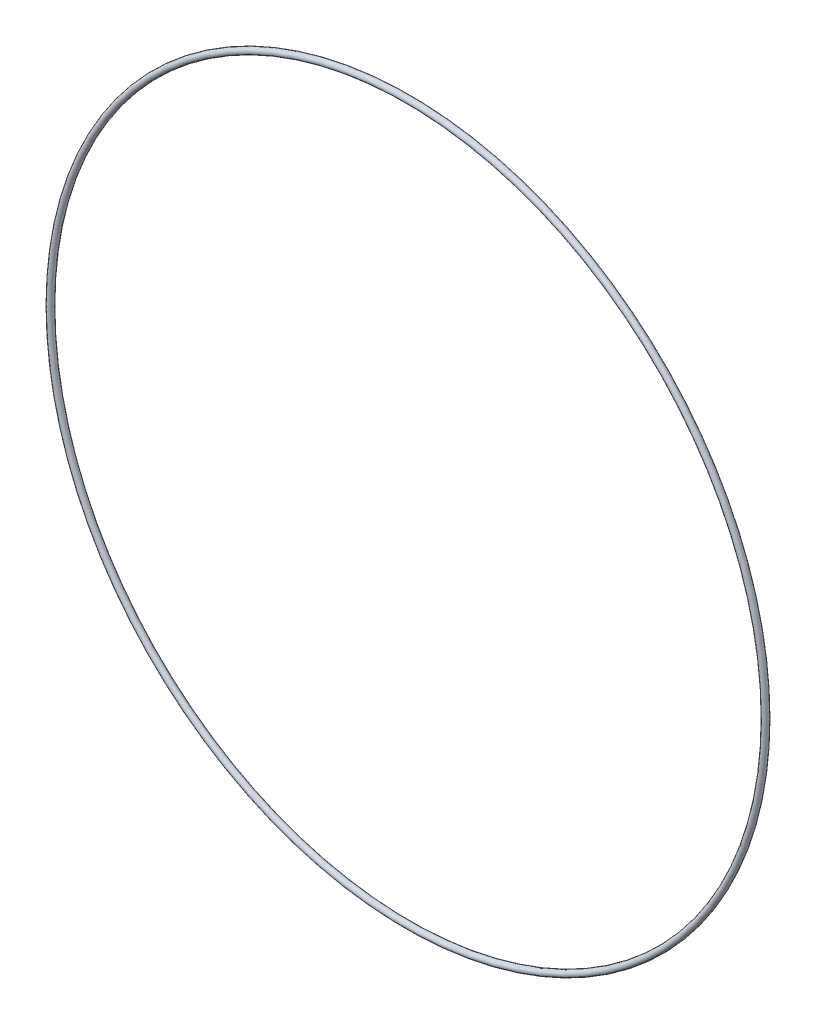
ISO-10303-21;
HEADER;
FILE_DESCRIPTION(('STEP AP214'),'2;1');
FILE_NAME('part.step','',(''),(''),'','','');
FILE_SCHEMA(('AUTOMOTIVE_DESIGN { 1 0 10303 214 1 1 1 1 }'));
ENDSEC;
DATA;
#1=APPLICATION_CONTEXT('core data for automotive mechanical design processes');
#2=APPLICATION_PROTOCOL_DEFINITION('international standard','automotive_design',2000,#1);
#3=PRODUCT_CONTEXT('',#1,'mechanical');
#4=PRODUCT('Part','Part','',(#3));
#5=PRODUCT_RELATED_PRODUCT_CATEGORY('part','',(#4));
#6=PRODUCT_DEFINITION_FORMATION('','',#4);
#7=PRODUCT_DEFINITION_CONTEXT('part definition',#1,'design');
#8=PRODUCT_DEFINITION('design','',#6,#7);
#9=PRODUCT_DEFINITION_SHAPE('','',#8);
#10=(LENGTH_UNIT() NAMED_UNIT(*) SI_UNIT(.MILLI.,.METRE.));
#11=(NAMED_UNIT(*) PLANE_ANGLE_UNIT() SI_UNIT($,.RADIAN.));
#12=(NAMED_UNIT(*) SI_UNIT($,.STERADIAN.) SOLID_ANGLE_UNIT());
#13=UNCERTAINTY_MEASURE_WITH_UNIT(LENGTH_MEASURE(1.E-05),#10,'distance_accuracy_value','');
#14=(GEOMETRIC_REPRESENTATION_CONTEXT(3) GLOBAL_UNCERTAINTY_ASSIGNED_CONTEXT((#13)) GLOBAL_UNIT_ASSIGNED_CONTEXT((#10,
#11,#12)) REPRESENTATION_CONTEXT('',''));
#15=CARTESIAN_POINT('',(0.,0.,0.));
#16=DIRECTION('',(0.,0.,1.));
#17=DIRECTION('',(1.,0.,0.));
#18=AXIS2_PLACEMENT_3D('',#15,#16,#17);
#19=CARTESIAN_POINT('',(0.,0.,0.));
#20=DIRECTION('',(0.,0.,1.));
#21=DIRECTION('',(1.,0.,0.));
#22=AXIS2_PLACEMENT_3D('',#19,#20,#21);
#23=TOROIDAL_SURFACE('',#22,114.5,1.);
#24=CARTESIAN_POINT('',(115.5,0.,0.));
#25=VERTEX_POINT('',#24);
#26=VERTEX_LOOP('',#25);
#27=FACE_BOUND('',#26,.T.);
#28=ADVANCED_FACE('F37',(#27),#23,.T.);
#29=CLOSED_SHELL('',(#28));
#30=MANIFOLD_SOLID_BREP('B2',#29);
#31=ADVANCED_BREP_SHAPE_REPRESENTATION('',(#18,#30),#14);
#32=SHAPE_DEFINITION_REPRESENTATION(#9,#31);
ENDSEC;
END-ISO-10303-21;
